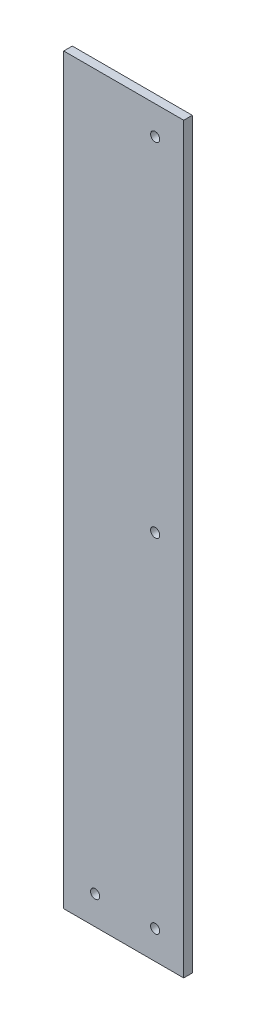
ISO-10303-21;
HEADER;
FILE_DESCRIPTION(('STEP AP214'),'2;1');
FILE_NAME('part.step','',(''),(''),'','','');
FILE_SCHEMA(('AUTOMOTIVE_DESIGN { 1 0 10303 214 1 1 1 1 }'));
ENDSEC;
DATA;
#1=APPLICATION_CONTEXT('core data for automotive mechanical design processes');
#2=APPLICATION_PROTOCOL_DEFINITION('international standard','automotive_design',2000,#1);
#3=PRODUCT_CONTEXT('',#1,'mechanical');
#4=PRODUCT('Part','Part','',(#3));
#5=PRODUCT_RELATED_PRODUCT_CATEGORY('part','',(#4));
#6=PRODUCT_DEFINITION_FORMATION('','',#4);
#7=PRODUCT_DEFINITION_CONTEXT('part definition',#1,'design');
#8=PRODUCT_DEFINITION('design','',#6,#7);
#9=PRODUCT_DEFINITION_SHAPE('','',#8);
#10=(LENGTH_UNIT() NAMED_UNIT(*) SI_UNIT(.MILLI.,.METRE.));
#11=(NAMED_UNIT(*) PLANE_ANGLE_UNIT() SI_UNIT($,.RADIAN.));
#12=(NAMED_UNIT(*) SI_UNIT($,.STERADIAN.) SOLID_ANGLE_UNIT());
#13=UNCERTAINTY_MEASURE_WITH_UNIT(LENGTH_MEASURE(1.E-05),#10,'distance_accuracy_value','');
#14=(GEOMETRIC_REPRESENTATION_CONTEXT(3) GLOBAL_UNCERTAINTY_ASSIGNED_CONTEXT((#13)) GLOBAL_UNIT_ASSIGNED_CONTEXT((#10,
#11,#12)) REPRESENTATION_CONTEXT('',''));
#15=CARTESIAN_POINT('',(0.,0.,0.));
#16=DIRECTION('',(0.,0.,1.));
#17=DIRECTION('',(1.,0.,0.));
#18=AXIS2_PLACEMENT_3D('',#15,#16,#17);
#19=CARTESIAN_POINT('',(0.,0.,3.));
#20=DIRECTION('',(1.,0.,0.));
#21=DIRECTION('',(0.,1.,0.));
#22=AXIS2_PLACEMENT_3D('',#19,#20,#21);
#23=PLANE('',#22);
#24=DIRECTION('',(0.,-1.,0.));
#25=VECTOR('',#24,1.);
#26=CARTESIAN_POINT('',(0.,0.,0.));
#27=LINE('',#26,#25);
#28=CARTESIAN_POINT('',(0.,260.,0.));
#29=VERTEX_POINT('',#28);
#30=CARTESIAN_POINT('',(0.,0.,0.));
#31=VERTEX_POINT('',#30);
#32=EDGE_CURVE('E102',#29,#31,#27,.T.);
#33=ORIENTED_EDGE('',*,*,#32,.T.);
#34=DIRECTION('',(0.,0.,-1.));
#35=VECTOR('',#34,1.);
#36=CARTESIAN_POINT('',(0.,0.,3.));
#37=LINE('',#36,#35);
#38=CARTESIAN_POINT('',(0.,0.,3.));
#39=VERTEX_POINT('',#38);
#40=EDGE_CURVE('E11',#39,#31,#37,.T.);
#41=ORIENTED_EDGE('',*,*,#40,.F.);
#42=DIRECTION('',(0.,-1.,0.));
#43=VECTOR('',#42,1.);
#44=CARTESIAN_POINT('',(0.,0.,3.));
#45=LINE('',#44,#43);
#46=CARTESIAN_POINT('',(0.,260.,3.));
#47=VERTEX_POINT('',#46);
#48=EDGE_CURVE('E90',#47,#39,#45,.T.);
#49=ORIENTED_EDGE('',*,*,#48,.F.);
#50=DIRECTION('',(0.,0.,-1.));
#51=VECTOR('',#50,1.);
#52=CARTESIAN_POINT('',(0.,260.,3.));
#53=LINE('',#52,#51);
#54=EDGE_CURVE('E98',#47,#29,#53,.T.);
#55=ORIENTED_EDGE('',*,*,#54,.T.);
#56=EDGE_LOOP('',(#33,#41,#49,#55));
#57=FACE_BOUND('',#56,.T.);
#58=ADVANCED_FACE('F39',(#57),#23,.F.);
#59=CARTESIAN_POINT('',(0.,0.,3.));
#60=DIRECTION('',(0.,1.,0.));
#61=DIRECTION('',(0.,0.,1.));
#62=AXIS2_PLACEMENT_3D('',#59,#60,#61);
#63=PLANE('',#62);
#64=DIRECTION('',(1.,0.,0.));
#65=VECTOR('',#64,1.);
#66=CARTESIAN_POINT('',(0.,0.,0.));
#67=LINE('',#66,#65);
#68=CARTESIAN_POINT('',(42.,0.,0.));
#69=VERTEX_POINT('',#68);
#70=EDGE_CURVE('E94',#31,#69,#67,.T.);
#71=ORIENTED_EDGE('',*,*,#70,.T.);
#72=DIRECTION('',(0.,0.,-1.));
#73=VECTOR('',#72,1.);
#74=CARTESIAN_POINT('',(42.,0.,3.));
#75=LINE('',#74,#73);
#76=CARTESIAN_POINT('',(42.,0.,3.));
#77=VERTEX_POINT('',#76);
#78=EDGE_CURVE('E47',#77,#69,#75,.T.);
#79=ORIENTED_EDGE('',*,*,#78,.F.);
#80=DIRECTION('',(1.,0.,0.));
#81=VECTOR('',#80,1.);
#82=CARTESIAN_POINT('',(0.,0.,3.));
#83=LINE('',#82,#81);
#84=EDGE_CURVE('E85',#39,#77,#83,.T.);
#85=ORIENTED_EDGE('',*,*,#84,.F.);
#86=ORIENTED_EDGE('',*,*,#40,.T.);
#87=EDGE_LOOP('',(#71,#79,#85,#86));
#88=FACE_BOUND('',#87,.T.);
#89=ADVANCED_FACE('F93',(#88),#63,.F.);
#90=CARTESIAN_POINT('',(42.,0.,3.));
#91=DIRECTION('',(-1.,0.,0.));
#92=DIRECTION('',(0.,-1.,0.));
#93=AXIS2_PLACEMENT_3D('',#90,#91,#92);
#94=PLANE('',#93);
#95=DIRECTION('',(0.,1.,0.));
#96=VECTOR('',#95,1.);
#97=CARTESIAN_POINT('',(42.,0.,0.));
#98=LINE('',#97,#96);
#99=CARTESIAN_POINT('',(42.,260.,0.));
#100=VERTEX_POINT('',#99);
#101=EDGE_CURVE('E72',#69,#100,#98,.T.);
#102=ORIENTED_EDGE('',*,*,#101,.T.);
#103=DIRECTION('',(0.,0.,-1.));
#104=VECTOR('',#103,1.);
#105=CARTESIAN_POINT('',(42.,260.,3.));
#106=LINE('',#105,#104);
#107=CARTESIAN_POINT('',(42.,260.,3.));
#108=VERTEX_POINT('',#107);
#109=EDGE_CURVE('E95',#108,#100,#106,.T.);
#110=ORIENTED_EDGE('',*,*,#109,.F.);
#111=DIRECTION('',(0.,1.,0.));
#112=VECTOR('',#111,1.);
#113=CARTESIAN_POINT('',(42.,0.,3.));
#114=LINE('',#113,#112);
#115=EDGE_CURVE('E88',#77,#108,#114,.T.);
#116=ORIENTED_EDGE('',*,*,#115,.F.);
#117=ORIENTED_EDGE('',*,*,#78,.T.);
#118=EDGE_LOOP('',(#102,#110,#116,#117));
#119=FACE_BOUND('',#118,.T.);
#120=ADVANCED_FACE('F96',(#119),#94,.F.);
#121=CARTESIAN_POINT('',(0.,260.,3.));
#122=DIRECTION('',(0.,-1.,0.));
#123=DIRECTION('',(0.,0.,-1.));
#124=AXIS2_PLACEMENT_3D('',#121,#122,#123);
#125=PLANE('',#124);
#126=DIRECTION('',(-1.,0.,0.));
#127=VECTOR('',#126,1.);
#128=CARTESIAN_POINT('',(0.,260.,0.));
#129=LINE('',#128,#127);
#130=EDGE_CURVE('E78',#100,#29,#129,.T.);
#131=ORIENTED_EDGE('',*,*,#130,.T.);
#132=ORIENTED_EDGE('',*,*,#54,.F.);
#133=DIRECTION('',(-1.,0.,0.));
#134=VECTOR('',#133,1.);
#135=CARTESIAN_POINT('',(0.,260.,3.));
#136=LINE('',#135,#134);
#137=EDGE_CURVE('E55',#108,#47,#136,.T.);
#138=ORIENTED_EDGE('',*,*,#137,.F.);
#139=ORIENTED_EDGE('',*,*,#109,.T.);
#140=EDGE_LOOP('',(#131,#132,#138,#139));
#141=FACE_BOUND('',#140,.T.);
#142=ADVANCED_FACE('F110',(#141),#125,.F.);
#143=CARTESIAN_POINT('',(0.,0.,3.));
#144=DIRECTION('',(0.,0.,-1.));
#145=DIRECTION('',(-1.,0.,0.));
#146=AXIS2_PLACEMENT_3D('',#143,#144,#145);
#147=PLANE('',#146);
#148=CARTESIAN_POINT('',(11.,10.,3.));
#149=DIRECTION('',(0.,0.,1.));
#150=DIRECTION('',(1.,0.,0.));
#151=AXIS2_PLACEMENT_3D('',#148,#149,#150);
#152=CIRCLE('',#151,1.59999999999999);
#153=CARTESIAN_POINT('',(12.6,10.,3.));
#154=VERTEX_POINT('',#153);
#155=EDGE_CURVE('E136',#154,#154,#152,.T.);
#156=ORIENTED_EDGE('',*,*,#155,.F.);
#157=EDGE_LOOP('',(#156));
#158=FACE_BOUND('',#157,.T.);
#159=CARTESIAN_POINT('',(32.,250.,3.));
#160=DIRECTION('',(0.,0.,1.));
#161=DIRECTION('',(1.,0.,0.));
#162=AXIS2_PLACEMENT_3D('',#159,#160,#161);
#163=CIRCLE('',#162,1.59999999999999);
#164=CARTESIAN_POINT('',(33.6,250.,3.));
#165=VERTEX_POINT('',#164);
#166=EDGE_CURVE('E130',#165,#165,#163,.T.);
#167=ORIENTED_EDGE('',*,*,#166,.F.);
#168=EDGE_LOOP('',(#167));
#169=FACE_BOUND('',#168,.T.);
#170=CARTESIAN_POINT('',(32.,10.,3.));
#171=DIRECTION('',(0.,0.,1.));
#172=DIRECTION('',(1.,0.,0.));
#173=AXIS2_PLACEMENT_3D('',#170,#171,#172);
#174=CIRCLE('',#173,1.59999999999999);
#175=CARTESIAN_POINT('',(33.6,10.,3.));
#176=VERTEX_POINT('',#175);
#177=EDGE_CURVE('E124',#176,#176,#174,.T.);
#178=ORIENTED_EDGE('',*,*,#177,.F.);
#179=EDGE_LOOP('',(#178));
#180=FACE_BOUND('',#179,.T.);
#181=CARTESIAN_POINT('',(32.,130.,3.));
#182=DIRECTION('',(0.,0.,1.));
#183=DIRECTION('',(1.,0.,0.));
#184=AXIS2_PLACEMENT_3D('',#181,#182,#183);
#185=CIRCLE('',#184,1.59999999999999);
#186=CARTESIAN_POINT('',(33.6,130.,3.));
#187=VERTEX_POINT('',#186);
#188=EDGE_CURVE('E118',#187,#187,#185,.T.);
#189=ORIENTED_EDGE('',*,*,#188,.F.);
#190=EDGE_LOOP('',(#189));
#191=FACE_BOUND('',#190,.T.);
#192=ORIENTED_EDGE('',*,*,#48,.T.);
#193=ORIENTED_EDGE('',*,*,#84,.T.);
#194=ORIENTED_EDGE('',*,*,#115,.T.);
#195=ORIENTED_EDGE('',*,*,#137,.T.);
#196=EDGE_LOOP('',(#192,#193,#194,#195));
#197=FACE_BOUND('',#196,.T.);
#198=ADVANCED_FACE('F86',(#158,#169,#180,#191,#197),#147,.F.);
#199=CARTESIAN_POINT('',(0.,0.,0.));
#200=DIRECTION('',(0.,0.,-1.));
#201=DIRECTION('',(-1.,0.,0.));
#202=AXIS2_PLACEMENT_3D('',#199,#200,#201);
#203=PLANE('',#202);
#204=CARTESIAN_POINT('',(11.,10.,0.));
#205=DIRECTION('',(0.,0.,1.));
#206=DIRECTION('',(1.,0.,0.));
#207=AXIS2_PLACEMENT_3D('',#204,#205,#206);
#208=CIRCLE('',#207,1.6);
#209=CARTESIAN_POINT('',(12.6,10.,0.));
#210=VERTEX_POINT('',#209);
#211=EDGE_CURVE('E133',#210,#210,#208,.T.);
#212=ORIENTED_EDGE('',*,*,#211,.T.);
#213=EDGE_LOOP('',(#212));
#214=FACE_BOUND('',#213,.T.);
#215=CARTESIAN_POINT('',(32.,250.,0.));
#216=DIRECTION('',(0.,0.,1.));
#217=DIRECTION('',(1.,0.,0.));
#218=AXIS2_PLACEMENT_3D('',#215,#216,#217);
#219=CIRCLE('',#218,1.6);
#220=CARTESIAN_POINT('',(33.6,250.,0.));
#221=VERTEX_POINT('',#220);
#222=EDGE_CURVE('E127',#221,#221,#219,.T.);
#223=ORIENTED_EDGE('',*,*,#222,.T.);
#224=EDGE_LOOP('',(#223));
#225=FACE_BOUND('',#224,.T.);
#226=CARTESIAN_POINT('',(32.,10.,0.));
#227=DIRECTION('',(0.,0.,1.));
#228=DIRECTION('',(1.,0.,0.));
#229=AXIS2_PLACEMENT_3D('',#226,#227,#228);
#230=CIRCLE('',#229,1.6);
#231=CARTESIAN_POINT('',(33.6,10.,0.));
#232=VERTEX_POINT('',#231);
#233=EDGE_CURVE('E121',#232,#232,#230,.T.);
#234=ORIENTED_EDGE('',*,*,#233,.T.);
#235=EDGE_LOOP('',(#234));
#236=FACE_BOUND('',#235,.T.);
#237=CARTESIAN_POINT('',(32.,130.,0.));
#238=DIRECTION('',(0.,0.,1.));
#239=DIRECTION('',(1.,0.,0.));
#240=AXIS2_PLACEMENT_3D('',#237,#238,#239);
#241=CIRCLE('',#240,1.6);
#242=CARTESIAN_POINT('',(33.6,130.,0.));
#243=VERTEX_POINT('',#242);
#244=EDGE_CURVE('E105',#243,#243,#241,.T.);
#245=ORIENTED_EDGE('',*,*,#244,.T.);
#246=EDGE_LOOP('',(#245));
#247=FACE_BOUND('',#246,.T.);
#248=ORIENTED_EDGE('',*,*,#32,.F.);
#249=ORIENTED_EDGE('',*,*,#130,.F.);
#250=ORIENTED_EDGE('',*,*,#101,.F.);
#251=ORIENTED_EDGE('',*,*,#70,.F.);
#252=EDGE_LOOP('',(#248,#249,#250,#251));
#253=FACE_BOUND('',#252,.T.);
#254=ADVANCED_FACE('F113',(#214,#225,#236,#247,#253),#203,.T.);
#255=CARTESIAN_POINT('',(32.,130.,3.));
#256=DIRECTION('',(0.,0.,1.));
#257=DIRECTION('',(1.,0.,0.));
#258=AXIS2_PLACEMENT_3D('',#255,#256,#257);
#259=CYLINDRICAL_SURFACE('',#258,1.59999999999999);
#260=ORIENTED_EDGE('',*,*,#244,.F.);
#261=EDGE_LOOP('',(#260));
#262=FACE_BOUND('',#261,.T.);
#263=ORIENTED_EDGE('',*,*,#188,.T.);
#264=EDGE_LOOP('',(#263));
#265=FACE_BOUND('',#264,.T.);
#266=ADVANCED_FACE('F151',(#262,#265),#259,.F.);
#267=CARTESIAN_POINT('',(32.,10.,3.));
#268=DIRECTION('',(0.,0.,1.));
#269=DIRECTION('',(1.,0.,0.));
#270=AXIS2_PLACEMENT_3D('',#267,#268,#269);
#271=CYLINDRICAL_SURFACE('',#270,1.59999999999999);
#272=ORIENTED_EDGE('',*,*,#233,.F.);
#273=EDGE_LOOP('',(#272));
#274=FACE_BOUND('',#273,.T.);
#275=ORIENTED_EDGE('',*,*,#177,.T.);
#276=EDGE_LOOP('',(#275));
#277=FACE_BOUND('',#276,.T.);
#278=ADVANCED_FACE('F153',(#274,#277),#271,.F.);
#279=CARTESIAN_POINT('',(32.,250.,3.));
#280=DIRECTION('',(0.,0.,1.));
#281=DIRECTION('',(1.,0.,0.));
#282=AXIS2_PLACEMENT_3D('',#279,#280,#281);
#283=CYLINDRICAL_SURFACE('',#282,1.59999999999999);
#284=ORIENTED_EDGE('',*,*,#222,.F.);
#285=EDGE_LOOP('',(#284));
#286=FACE_BOUND('',#285,.T.);
#287=ORIENTED_EDGE('',*,*,#166,.T.);
#288=EDGE_LOOP('',(#287));
#289=FACE_BOUND('',#288,.T.);
#290=ADVANCED_FACE('F160',(#286,#289),#283,.F.);
#291=CARTESIAN_POINT('',(11.,10.,3.));
#292=DIRECTION('',(0.,0.,1.));
#293=DIRECTION('',(1.,0.,0.));
#294=AXIS2_PLACEMENT_3D('',#291,#292,#293);
#295=CYLINDRICAL_SURFACE('',#294,1.59999999999999);
#296=ORIENTED_EDGE('',*,*,#211,.F.);
#297=EDGE_LOOP('',(#296));
#298=FACE_BOUND('',#297,.T.);
#299=ORIENTED_EDGE('',*,*,#155,.T.);
#300=EDGE_LOOP('',(#299));
#301=FACE_BOUND('',#300,.T.);
#302=ADVANCED_FACE('F140',(#298,#301),#295,.F.);
#303=CLOSED_SHELL('',(#58,#89,#120,#142,#198,#254,#266,#278,#290,#302));
#304=MANIFOLD_SOLID_BREP('B2',#303);
#305=ADVANCED_BREP_SHAPE_REPRESENTATION('',(#18,#304),#14);
#306=SHAPE_DEFINITION_REPRESENTATION(#9,#305);
ENDSEC;
END-ISO-10303-21;
